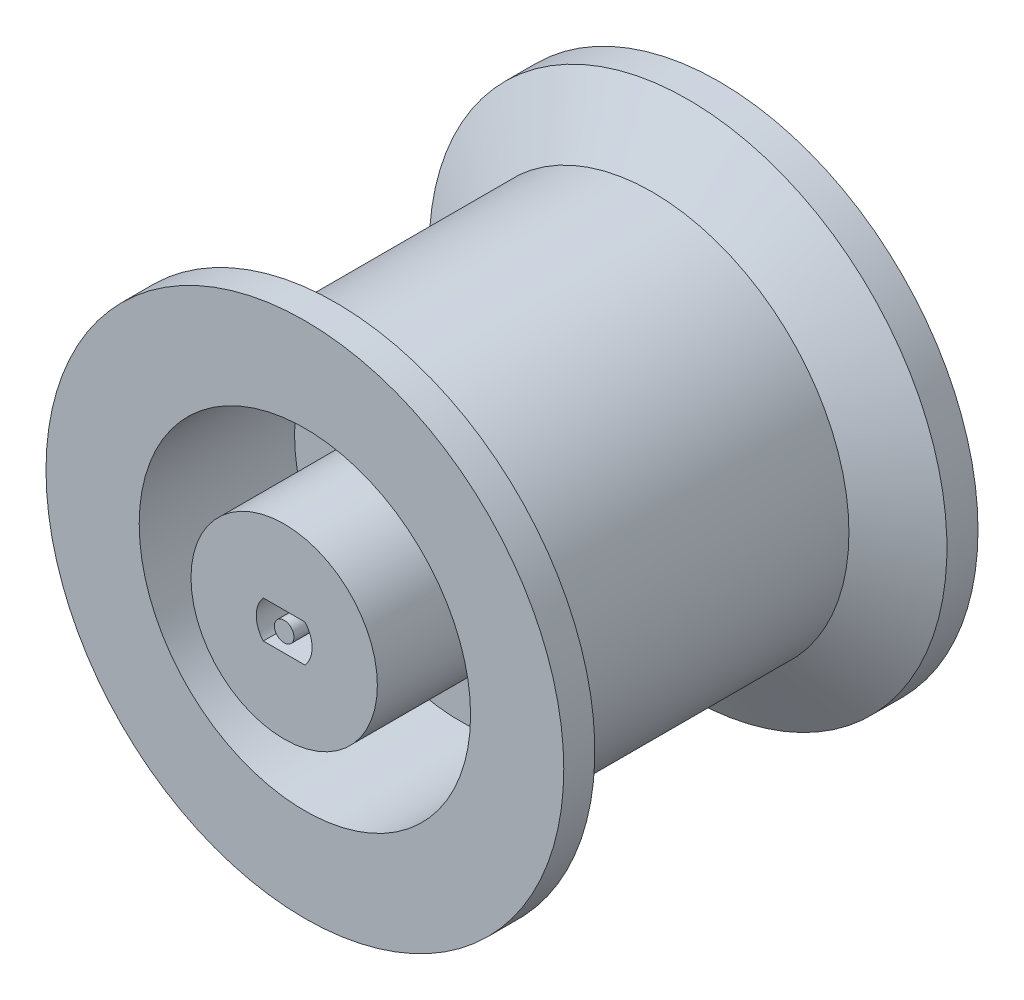
ISO-10303-21;
HEADER;
FILE_DESCRIPTION(('STEP AP214'),'2;1');
FILE_NAME('part.step','',(''),(''),'','','');
FILE_SCHEMA(('AUTOMOTIVE_DESIGN { 1 0 10303 214 1 1 1 1 }'));
ENDSEC;
DATA;
#1=APPLICATION_CONTEXT('core data for automotive mechanical design processes');
#2=APPLICATION_PROTOCOL_DEFINITION('international standard','automotive_design',2000,#1);
#3=PRODUCT_CONTEXT('',#1,'mechanical');
#4=PRODUCT('Part','Part','',(#3));
#5=PRODUCT_RELATED_PRODUCT_CATEGORY('part','',(#4));
#6=PRODUCT_DEFINITION_FORMATION('','',#4);
#7=PRODUCT_DEFINITION_CONTEXT('part definition',#1,'design');
#8=PRODUCT_DEFINITION('design','',#6,#7);
#9=PRODUCT_DEFINITION_SHAPE('','',#8);
#10=(LENGTH_UNIT() NAMED_UNIT(*) SI_UNIT(.MILLI.,.METRE.));
#11=(NAMED_UNIT(*) PLANE_ANGLE_UNIT() SI_UNIT($,.RADIAN.));
#12=(NAMED_UNIT(*) SI_UNIT($,.STERADIAN.) SOLID_ANGLE_UNIT());
#13=UNCERTAINTY_MEASURE_WITH_UNIT(LENGTH_MEASURE(1.E-05),#10,'distance_accuracy_value','');
#14=(GEOMETRIC_REPRESENTATION_CONTEXT(3) GLOBAL_UNCERTAINTY_ASSIGNED_CONTEXT((#13)) GLOBAL_UNIT_ASSIGNED_CONTEXT((#10,
#11,#12)) REPRESENTATION_CONTEXT('',''));
#15=CARTESIAN_POINT('',(0.,0.,0.));
#16=DIRECTION('',(0.,0.,1.));
#17=DIRECTION('',(1.,0.,0.));
#18=AXIS2_PLACEMENT_3D('',#15,#16,#17);
#19=CARTESIAN_POINT('',(0.,0.,20.));
#20=DIRECTION('',(0.,0.,-1.));
#21=DIRECTION('',(-1.,0.,0.));
#22=AXIS2_PLACEMENT_3D('',#19,#20,#21);
#23=CYLINDRICAL_SURFACE('',#22,25.);
#24=CARTESIAN_POINT('',(0.,0.,-17.));
#25=DIRECTION('',(0.,0.,-1.));
#26=DIRECTION('',(-1.,0.,0.));
#27=AXIS2_PLACEMENT_3D('',#24,#25,#26);
#28=CIRCLE('',#27,25.);
#29=CARTESIAN_POINT('',(-25.,0.,-17.));
#30=VERTEX_POINT('',#29);
#31=EDGE_CURVE('E123',#30,#30,#28,.T.);
#32=ORIENTED_EDGE('',*,*,#31,.T.);
#33=EDGE_LOOP('',(#32));
#34=FACE_BOUND('',#33,.T.);
#35=CARTESIAN_POINT('',(0.,0.,-20.));
#36=DIRECTION('',(0.,0.,1.));
#37=DIRECTION('',(1.,0.,0.));
#38=AXIS2_PLACEMENT_3D('',#35,#36,#37);
#39=CIRCLE('',#38,25.);
#40=CARTESIAN_POINT('',(25.,0.,-20.));
#41=VERTEX_POINT('',#40);
#42=EDGE_CURVE('E160',#41,#41,#39,.T.);
#43=ORIENTED_EDGE('',*,*,#42,.T.);
#44=EDGE_LOOP('',(#43));
#45=FACE_BOUND('',#44,.T.);
#46=ADVANCED_FACE('F33',(#34,#45),#23,.T.);
#47=CARTESIAN_POINT('',(0.,0.,20.));
#48=DIRECTION('',(0.,0.,1.));
#49=DIRECTION('',(1.,0.,0.));
#50=AXIS2_PLACEMENT_3D('',#47,#48,#49);
#51=PLANE('',#50);
#52=CARTESIAN_POINT('',(0.,0.,20.));
#53=DIRECTION('',(0.,0.,1.));
#54=DIRECTION('',(1.,0.,0.));
#55=AXIS2_PLACEMENT_3D('',#52,#53,#54);
#56=CIRCLE('',#55,16.);
#57=CARTESIAN_POINT('',(16.,0.,20.));
#58=VERTEX_POINT('',#57);
#59=EDGE_CURVE('E153',#58,#58,#56,.T.);
#60=ORIENTED_EDGE('',*,*,#59,.F.);
#61=EDGE_LOOP('',(#60));
#62=FACE_BOUND('',#61,.T.);
#63=CARTESIAN_POINT('',(0.,0.,20.));
#64=DIRECTION('',(0.,0.,1.));
#65=DIRECTION('',(1.,0.,0.));
#66=AXIS2_PLACEMENT_3D('',#63,#64,#65);
#67=CIRCLE('',#66,25.);
#68=CARTESIAN_POINT('',(25.,0.,20.));
#69=VERTEX_POINT('',#68);
#70=EDGE_CURVE('E163',#69,#69,#67,.T.);
#71=ORIENTED_EDGE('',*,*,#70,.T.);
#72=EDGE_LOOP('',(#71));
#73=FACE_BOUND('',#72,.T.);
#74=ADVANCED_FACE('F209',(#62,#73),#51,.T.);
#75=CARTESIAN_POINT('',(0.,0.,-20.));
#76=DIRECTION('',(0.,0.,1.));
#77=DIRECTION('',(1.,0.,0.));
#78=AXIS2_PLACEMENT_3D('',#75,#76,#77);
#79=PLANE('',#78);
#80=CARTESIAN_POINT('',(0.,0.,-20.));
#81=DIRECTION('',(0.,0.,1.));
#82=DIRECTION('',(1.,0.,0.));
#83=AXIS2_PLACEMENT_3D('',#80,#81,#82);
#84=CIRCLE('',#83,16.);
#85=CARTESIAN_POINT('',(16.,0.,-20.));
#86=VERTEX_POINT('',#85);
#87=EDGE_CURVE('E154',#86,#86,#84,.T.);
#88=ORIENTED_EDGE('',*,*,#87,.T.);
#89=EDGE_LOOP('',(#88));
#90=FACE_BOUND('',#89,.T.);
#91=ORIENTED_EDGE('',*,*,#42,.F.);
#92=EDGE_LOOP('',(#91));
#93=FACE_BOUND('',#92,.T.);
#94=ADVANCED_FACE('F206',(#90,#93),#79,.F.);
#95=CARTESIAN_POINT('',(0.,0.,17.));
#96=DIRECTION('',(0.,0.,-1.));
#97=DIRECTION('',(-1.,0.,0.));
#98=AXIS2_PLACEMENT_3D('',#95,#96,#97);
#99=CIRCLE('',#98,25.);
#100=CARTESIAN_POINT('',(-25.,0.,17.));
#101=VERTEX_POINT('',#100);
#102=EDGE_CURVE('E112',#101,#101,#99,.T.);
#103=ORIENTED_EDGE('',*,*,#102,.F.);
#104=EDGE_LOOP('',(#103));
#105=FACE_BOUND('',#104,.T.);
#106=ORIENTED_EDGE('',*,*,#70,.F.);
#107=EDGE_LOOP('',(#106));
#108=FACE_BOUND('',#107,.T.);
#109=ADVANCED_FACE('F35',(#105,#108),#23,.T.);
#110=CARTESIAN_POINT('',(0.,0.,5.));
#111=DIRECTION('',(0.,0.,1.));
#112=DIRECTION('',(1.,0.,0.));
#113=AXIS2_PLACEMENT_3D('',#110,#111,#112);
#114=CYLINDRICAL_SURFACE('',#113,16.);
#115=CARTESIAN_POINT('',(0.,0.,5.));
#116=DIRECTION('',(0.,0.,1.));
#117=DIRECTION('',(1.,0.,0.));
#118=AXIS2_PLACEMENT_3D('',#115,#116,#117);
#119=CIRCLE('',#118,16.);
#120=CARTESIAN_POINT('',(16.,0.,5.));
#121=VERTEX_POINT('',#120);
#122=EDGE_CURVE('E157',#121,#121,#119,.T.);
#123=ORIENTED_EDGE('',*,*,#122,.F.);
#124=EDGE_LOOP('',(#123));
#125=FACE_BOUND('',#124,.T.);
#126=ORIENTED_EDGE('',*,*,#59,.T.);
#127=EDGE_LOOP('',(#126));
#128=FACE_BOUND('',#127,.T.);
#129=ADVANCED_FACE('F220',(#125,#128),#114,.F.);
#130=CARTESIAN_POINT('',(0.,0.,5.));
#131=DIRECTION('',(0.,0.,1.));
#132=DIRECTION('',(1.,0.,0.));
#133=AXIS2_PLACEMENT_3D('',#130,#131,#132);
#134=PLANE('',#133);
#135=CARTESIAN_POINT('',(0.,0.,5.));
#136=DIRECTION('',(0.,0.,1.));
#137=DIRECTION('',(1.,0.,0.));
#138=AXIS2_PLACEMENT_3D('',#135,#136,#137);
#139=CIRCLE('',#138,9.);
#140=CARTESIAN_POINT('',(9.,0.,5.));
#141=VERTEX_POINT('',#140);
#142=EDGE_CURVE('E11',#141,#141,#139,.T.);
#143=ORIENTED_EDGE('',*,*,#142,.F.);
#144=EDGE_LOOP('',(#143));
#145=FACE_BOUND('',#144,.T.);
#146=CARTESIAN_POINT('',(11.4126781955418,3.7082039324995,5.));
#147=DIRECTION('',(0.,0.,1.));
#148=DIRECTION('',(0.309016994374958,-0.95105651629515,0.));
#149=AXIS2_PLACEMENT_3D('',#146,#147,#148);
#150=CIRCLE('',#149,2.5);
#151=CARTESIAN_POINT('',(12.1852206814792,1.33056264176162,5.));
#152=VERTEX_POINT('',#151);
#153=EDGE_CURVE('E131',#152,#152,#150,.T.);
#154=ORIENTED_EDGE('',*,*,#153,.F.);
#155=EDGE_LOOP('',(#154));
#156=FACE_BOUND('',#155,.T.);
#157=CARTESIAN_POINT('',(7.05342302750976,-9.70820393249931,5.));
#158=DIRECTION('',(0.,0.,1.));
#159=DIRECTION('',(-0.809016994374942,-0.58778525229248,0.));
#160=AXIS2_PLACEMENT_3D('',#157,#158,#159);
#161=CIRCLE('',#160,2.5);
#162=CARTESIAN_POINT('',(5.03088054157241,-11.1776670632305,5.));
#163=VERTEX_POINT('',#162);
#164=EDGE_CURVE('E137',#163,#163,#161,.T.);
#165=ORIENTED_EDGE('',*,*,#164,.F.);
#166=EDGE_LOOP('',(#165));
#167=FACE_BOUND('',#166,.T.);
#168=CARTESIAN_POINT('',(-7.05342302750962,-9.70820393249941,5.));
#169=DIRECTION('',(0.,0.,1.));
#170=DIRECTION('',(-0.809016994374951,0.587785252292469,0.));
#171=AXIS2_PLACEMENT_3D('',#168,#169,#170);
#172=CIRCLE('',#171,2.5);
#173=CARTESIAN_POINT('',(-9.075965513447,-8.23874080176824,5.));
#174=VERTEX_POINT('',#173);
#175=EDGE_CURVE('E133',#174,#174,#172,.T.);
#176=ORIENTED_EDGE('',*,*,#175,.F.);
#177=EDGE_LOOP('',(#176));
#178=FACE_BOUND('',#177,.T.);
#179=CARTESIAN_POINT('',(-11.4126781955419,3.70820393249934,5.));
#180=DIRECTION('',(0.,0.,1.));
#181=DIRECTION('',(0.309016994374945,0.951056516295155,0.));
#182=AXIS2_PLACEMENT_3D('',#179,#180,#181);
#183=CIRCLE('',#182,2.5);
#184=CARTESIAN_POINT('',(-10.6401357096045,6.08584522323723,5.));
#185=VERTEX_POINT('',#184);
#186=EDGE_CURVE('E136',#185,#185,#183,.T.);
#187=ORIENTED_EDGE('',*,*,#186,.F.);
#188=EDGE_LOOP('',(#187));
#189=FACE_BOUND('',#188,.T.);
#190=CARTESIAN_POINT('',(0.,12.,5.));
#191=DIRECTION('',(0.,0.,1.));
#192=DIRECTION('',(1.,0.,0.));
#193=AXIS2_PLACEMENT_3D('',#190,#191,#192);
#194=CIRCLE('',#193,2.5);
#195=CARTESIAN_POINT('',(2.5,12.,5.));
#196=VERTEX_POINT('',#195);
#197=EDGE_CURVE('E145',#196,#196,#194,.T.);
#198=ORIENTED_EDGE('',*,*,#197,.F.);
#199=EDGE_LOOP('',(#198));
#200=FACE_BOUND('',#199,.T.);
#201=ORIENTED_EDGE('',*,*,#122,.T.);
#202=EDGE_LOOP('',(#201));
#203=FACE_BOUND('',#202,.T.);
#204=ADVANCED_FACE('F202',(#145,#156,#167,#178,#189,#200,#203),#134,.T.);
#205=CARTESIAN_POINT('',(0.,0.,-5.));
#206=DIRECTION('',(0.,0.,-1.));
#207=DIRECTION('',(-1.,0.,0.));
#208=AXIS2_PLACEMENT_3D('',#205,#206,#207);
#209=CYLINDRICAL_SURFACE('',#208,16.);
#210=CARTESIAN_POINT('',(0.,0.,-5.));
#211=DIRECTION('',(0.,0.,1.));
#212=DIRECTION('',(1.,0.,0.));
#213=AXIS2_PLACEMENT_3D('',#210,#211,#212);
#214=CIRCLE('',#213,16.);
#215=CARTESIAN_POINT('',(16.,0.,-5.));
#216=VERTEX_POINT('',#215);
#217=EDGE_CURVE('E150',#216,#216,#214,.T.);
#218=ORIENTED_EDGE('',*,*,#217,.T.);
#219=EDGE_LOOP('',(#218));
#220=FACE_BOUND('',#219,.T.);
#221=ORIENTED_EDGE('',*,*,#87,.F.);
#222=EDGE_LOOP('',(#221));
#223=FACE_BOUND('',#222,.T.);
#224=ADVANCED_FACE('F187',(#220,#223),#209,.F.);
#225=CARTESIAN_POINT('',(0.,0.,-5.));
#226=DIRECTION('',(0.,0.,-1.));
#227=DIRECTION('',(1.,0.,0.));
#228=AXIS2_PLACEMENT_3D('',#225,#226,#227);
#229=PLANE('',#228);
#230=CARTESIAN_POINT('',(0.,0.,-5.));
#231=DIRECTION('',(0.,0.,-1.));
#232=DIRECTION('',(-1.,0.,0.));
#233=AXIS2_PLACEMENT_3D('',#230,#231,#232);
#234=CIRCLE('',#233,9.);
#235=CARTESIAN_POINT('',(-9.,0.,-5.));
#236=VERTEX_POINT('',#235);
#237=EDGE_CURVE('E37',#236,#236,#234,.T.);
#238=ORIENTED_EDGE('',*,*,#237,.F.);
#239=EDGE_LOOP('',(#238));
#240=FACE_BOUND('',#239,.T.);
#241=CARTESIAN_POINT('',(11.4126781955418,3.7082039324995,-5.));
#242=DIRECTION('',(0.,0.,-1.));
#243=DIRECTION('',(-1.,0.,0.));
#244=AXIS2_PLACEMENT_3D('',#241,#242,#243);
#245=CIRCLE('',#244,2.5);
#246=CARTESIAN_POINT('',(8.9126781955418,3.7082039324995,-5.));
#247=VERTEX_POINT('',#246);
#248=EDGE_CURVE('E149',#247,#247,#245,.T.);
#249=ORIENTED_EDGE('',*,*,#248,.F.);
#250=EDGE_LOOP('',(#249));
#251=FACE_BOUND('',#250,.T.);
#252=CARTESIAN_POINT('',(7.05342302750976,-9.70820393249931,-5.));
#253=DIRECTION('',(0.,0.,-1.));
#254=DIRECTION('',(-1.,0.,0.));
#255=AXIS2_PLACEMENT_3D('',#252,#253,#254);
#256=CIRCLE('',#255,2.5);
#257=CARTESIAN_POINT('',(4.55342302750976,-9.70820393249931,-5.));
#258=VERTEX_POINT('',#257);
#259=EDGE_CURVE('E175',#258,#258,#256,.T.);
#260=ORIENTED_EDGE('',*,*,#259,.F.);
#261=EDGE_LOOP('',(#260));
#262=FACE_BOUND('',#261,.T.);
#263=CARTESIAN_POINT('',(-7.05342302750962,-9.70820393249941,-5.));
#264=DIRECTION('',(0.,0.,-1.));
#265=DIRECTION('',(-1.,0.,0.));
#266=AXIS2_PLACEMENT_3D('',#263,#264,#265);
#267=CIRCLE('',#266,2.5);
#268=CARTESIAN_POINT('',(-9.55342302750963,-9.70820393249941,-5.));
#269=VERTEX_POINT('',#268);
#270=EDGE_CURVE('E172',#269,#269,#267,.T.);
#271=ORIENTED_EDGE('',*,*,#270,.F.);
#272=EDGE_LOOP('',(#271));
#273=FACE_BOUND('',#272,.T.);
#274=CARTESIAN_POINT('',(-11.4126781955419,3.70820393249934,-5.));
#275=DIRECTION('',(0.,0.,-1.));
#276=DIRECTION('',(-1.,0.,0.));
#277=AXIS2_PLACEMENT_3D('',#274,#275,#276);
#278=CIRCLE('',#277,2.5);
#279=CARTESIAN_POINT('',(-13.9126781955419,3.70820393249934,-5.));
#280=VERTEX_POINT('',#279);
#281=EDGE_CURVE('E144',#280,#280,#278,.T.);
#282=ORIENTED_EDGE('',*,*,#281,.F.);
#283=EDGE_LOOP('',(#282));
#284=FACE_BOUND('',#283,.T.);
#285=CARTESIAN_POINT('',(0.,12.,-5.));
#286=DIRECTION('',(0.,0.,-1.));
#287=DIRECTION('',(-1.,0.,0.));
#288=AXIS2_PLACEMENT_3D('',#285,#286,#287);
#289=CIRCLE('',#288,2.5);
#290=CARTESIAN_POINT('',(-2.5,12.,-5.));
#291=VERTEX_POINT('',#290);
#292=EDGE_CURVE('E148',#291,#291,#289,.T.);
#293=ORIENTED_EDGE('',*,*,#292,.F.);
#294=EDGE_LOOP('',(#293));
#295=FACE_BOUND('',#294,.T.);
#296=ORIENTED_EDGE('',*,*,#217,.F.);
#297=EDGE_LOOP('',(#296));
#298=FACE_BOUND('',#297,.T.);
#299=ADVANCED_FACE('F183',(#240,#251,#262,#273,#284,#295,#298),#229,.T.);
#300=CARTESIAN_POINT('',(0.,12.,-20.));
#301=DIRECTION('',(0.,0.,1.));
#302=DIRECTION('',(1.,0.,0.));
#303=AXIS2_PLACEMENT_3D('',#300,#301,#302);
#304=CYLINDRICAL_SURFACE('',#303,2.5);
#305=ORIENTED_EDGE('',*,*,#292,.T.);
#306=EDGE_LOOP('',(#305));
#307=FACE_BOUND('',#306,.T.);
#308=ORIENTED_EDGE('',*,*,#197,.T.);
#309=EDGE_LOOP('',(#308));
#310=FACE_BOUND('',#309,.T.);
#311=ADVANCED_FACE('F186',(#307,#310),#304,.F.);
#312=CARTESIAN_POINT('',(-11.4126781955419,3.70820393249934,-20.));
#313=DIRECTION('',(0.,0.,1.));
#314=DIRECTION('',(1.,0.,0.));
#315=AXIS2_PLACEMENT_3D('',#312,#313,#314);
#316=CYLINDRICAL_SURFACE('',#315,2.5);
#317=ORIENTED_EDGE('',*,*,#281,.T.);
#318=EDGE_LOOP('',(#317));
#319=FACE_BOUND('',#318,.T.);
#320=ORIENTED_EDGE('',*,*,#186,.T.);
#321=EDGE_LOOP('',(#320));
#322=FACE_BOUND('',#321,.T.);
#323=ADVANCED_FACE('F270',(#319,#322),#316,.F.);
#324=CARTESIAN_POINT('',(-7.05342302750962,-9.70820393249941,-20.));
#325=DIRECTION('',(0.,0.,1.));
#326=DIRECTION('',(1.,0.,0.));
#327=AXIS2_PLACEMENT_3D('',#324,#325,#326);
#328=CYLINDRICAL_SURFACE('',#327,2.5);
#329=ORIENTED_EDGE('',*,*,#270,.T.);
#330=EDGE_LOOP('',(#329));
#331=FACE_BOUND('',#330,.T.);
#332=ORIENTED_EDGE('',*,*,#175,.T.);
#333=EDGE_LOOP('',(#332));
#334=FACE_BOUND('',#333,.T.);
#335=ADVANCED_FACE('F266',(#331,#334),#328,.F.);
#336=CARTESIAN_POINT('',(7.05342302750976,-9.70820393249931,-20.));
#337=DIRECTION('',(0.,0.,1.));
#338=DIRECTION('',(1.,0.,0.));
#339=AXIS2_PLACEMENT_3D('',#336,#337,#338);
#340=CYLINDRICAL_SURFACE('',#339,2.5);
#341=ORIENTED_EDGE('',*,*,#259,.T.);
#342=EDGE_LOOP('',(#341));
#343=FACE_BOUND('',#342,.T.);
#344=ORIENTED_EDGE('',*,*,#164,.T.);
#345=EDGE_LOOP('',(#344));
#346=FACE_BOUND('',#345,.T.);
#347=ADVANCED_FACE('F269',(#343,#346),#340,.F.);
#348=CARTESIAN_POINT('',(11.4126781955418,3.7082039324995,-20.));
#349=DIRECTION('',(0.,0.,1.));
#350=DIRECTION('',(1.,0.,0.));
#351=AXIS2_PLACEMENT_3D('',#348,#349,#350);
#352=CYLINDRICAL_SURFACE('',#351,2.5);
#353=ORIENTED_EDGE('',*,*,#248,.T.);
#354=EDGE_LOOP('',(#353));
#355=FACE_BOUND('',#354,.T.);
#356=ORIENTED_EDGE('',*,*,#153,.T.);
#357=EDGE_LOOP('',(#356));
#358=FACE_BOUND('',#357,.T.);
#359=ADVANCED_FACE('F180',(#355,#358),#352,.F.);
#360=CARTESIAN_POINT('',(0.,0.,-7.));
#361=DIRECTION('',(0.,0.,1.));
#362=DIRECTION('',(1.,0.,0.));
#363=AXIS2_PLACEMENT_3D('',#360,#361,#362);
#364=CYLINDRICAL_SURFACE('',#363,9.);
#365=ORIENTED_EDGE('',*,*,#237,.T.);
#366=EDGE_LOOP('',(#365));
#367=FACE_BOUND('',#366,.T.);
#368=CARTESIAN_POINT('',(0.,0.,-7.));
#369=DIRECTION('',(0.,0.,1.));
#370=DIRECTION('',(1.,0.,0.));
#371=AXIS2_PLACEMENT_3D('',#368,#369,#370);
#372=CIRCLE('',#371,9.);
#373=CARTESIAN_POINT('',(9.,0.,-7.));
#374=VERTEX_POINT('',#373);
#375=EDGE_CURVE('E129',#374,#374,#372,.T.);
#376=ORIENTED_EDGE('',*,*,#375,.T.);
#377=EDGE_LOOP('',(#376));
#378=FACE_BOUND('',#377,.T.);
#379=ADVANCED_FACE('F261',(#367,#378),#364,.T.);
#380=CARTESIAN_POINT('',(0.,0.,-7.));
#381=DIRECTION('',(0.,0.,1.));
#382=DIRECTION('',(1.,0.,0.));
#383=AXIS2_PLACEMENT_3D('',#380,#381,#382);
#384=PLANE('',#383);
#385=ORIENTED_EDGE('',*,*,#375,.F.);
#386=EDGE_LOOP('',(#385));
#387=FACE_BOUND('',#386,.T.);
#388=ADVANCED_FACE('F258',(#387),#384,.F.);
#389=ORIENTED_EDGE('',*,*,#142,.T.);
#390=EDGE_LOOP('',(#389));
#391=FACE_BOUND('',#390,.T.);
#392=CARTESIAN_POINT('',(0.,0.,22.));
#393=DIRECTION('',(0.,0.,1.));
#394=DIRECTION('',(1.,0.,0.));
#395=AXIS2_PLACEMENT_3D('',#392,#393,#394);
#396=CIRCLE('',#395,9.);
#397=CARTESIAN_POINT('',(9.,0.,22.));
#398=VERTEX_POINT('',#397);
#399=EDGE_CURVE('E126',#398,#398,#396,.T.);
#400=ORIENTED_EDGE('',*,*,#399,.F.);
#401=EDGE_LOOP('',(#400));
#402=FACE_BOUND('',#401,.T.);
#403=ADVANCED_FACE('F256',(#391,#402),#364,.T.);
#404=CARTESIAN_POINT('',(0.,0.,22.));
#405=DIRECTION('',(0.,0.,1.));
#406=DIRECTION('',(1.,0.,0.));
#407=AXIS2_PLACEMENT_3D('',#404,#405,#406);
#408=PLANE('',#407);
#409=CARTESIAN_POINT('',(0.0242155354449412,0.,22.));
#410=DIRECTION('',(0.,0.,1.));
#411=DIRECTION('',(1.,0.,0.));
#412=AXIS2_PLACEMENT_3D('',#409,#410,#411);
#413=CIRCLE('',#412,2.72);
#414=CARTESIAN_POINT('',(-2.015,1.8,22.));
#415=VERTEX_POINT('',#414);
#416=CARTESIAN_POINT('',(-2.015,-1.8,22.));
#417=VERTEX_POINT('',#416);
#418=EDGE_CURVE('E49',#415,#417,#413,.T.);
#419=ORIENTED_EDGE('',*,*,#418,.F.);
#420=DIRECTION('',(-1.,0.,0.));
#421=VECTOR('',#420,1.);
#422=CARTESIAN_POINT('',(-2.015,1.8,22.));
#423=LINE('',#422,#421);
#424=CARTESIAN_POINT('',(2.015,1.8,22.));
#425=VERTEX_POINT('',#424);
#426=EDGE_CURVE('E100',#425,#415,#423,.T.);
#427=ORIENTED_EDGE('',*,*,#426,.F.);
#428=CARTESIAN_POINT('',(-0.0242155354449412,0.,22.));
#429=DIRECTION('',(0.,0.,1.));
#430=DIRECTION('',(-1.,0.,0.));
#431=AXIS2_PLACEMENT_3D('',#428,#429,#430);
#432=CIRCLE('',#431,2.72);
#433=CARTESIAN_POINT('',(2.015,-1.8,22.));
#434=VERTEX_POINT('',#433);
#435=EDGE_CURVE('E108',#434,#425,#432,.T.);
#436=ORIENTED_EDGE('',*,*,#435,.F.);
#437=DIRECTION('',(1.,0.,0.));
#438=VECTOR('',#437,1.);
#439=CARTESIAN_POINT('',(-2.015,-1.8,22.));
#440=LINE('',#439,#438);
#441=EDGE_CURVE('E84',#417,#434,#440,.T.);
#442=ORIENTED_EDGE('',*,*,#441,.F.);
#443=EDGE_LOOP('',(#419,#427,#436,#442));
#444=FACE_BOUND('',#443,.T.);
#445=ORIENTED_EDGE('',*,*,#399,.T.);
#446=EDGE_LOOP('',(#445));
#447=FACE_BOUND('',#446,.T.);
#448=ADVANCED_FACE('F252',(#444,#447),#408,.T.);
#449=CARTESIAN_POINT('',(0.,0.,-13.5358983848622));
#450=DIRECTION('',(0.,0.,-1.));
#451=DIRECTION('',(-1.,0.,0.));
#452=AXIS2_PLACEMENT_3D('',#449,#450,#451);
#453=CONICAL_SURFACE('',#452,19.,1.04719755119659);
#454=ORIENTED_EDGE('',*,*,#31,.F.);
#455=EDGE_LOOP('',(#454));
#456=FACE_BOUND('',#455,.T.);
#457=CARTESIAN_POINT('',(0.,0.,-13.5358983848622));
#458=DIRECTION('',(0.,0.,-1.));
#459=DIRECTION('',(-1.,0.,0.));
#460=AXIS2_PLACEMENT_3D('',#457,#458,#459);
#461=CIRCLE('',#460,19.);
#462=CARTESIAN_POINT('',(-19.,0.,-13.5358983848622));
#463=VERTEX_POINT('',#462);
#464=EDGE_CURVE('E120',#463,#463,#461,.T.);
#465=ORIENTED_EDGE('',*,*,#464,.T.);
#466=EDGE_LOOP('',(#465));
#467=FACE_BOUND('',#466,.T.);
#468=ADVANCED_FACE('F244',(#456,#467),#453,.T.);
#469=CARTESIAN_POINT('',(0.,0.,-25.2845931145285));
#470=DIRECTION('',(0.,0.,-1.));
#471=DIRECTION('',(-1.,0.,0.));
#472=AXIS2_PLACEMENT_3D('',#469,#470,#471);
#473=CYLINDRICAL_SURFACE('',#472,19.);
#474=ORIENTED_EDGE('',*,*,#464,.F.);
#475=EDGE_LOOP('',(#474));
#476=FACE_BOUND('',#475,.T.);
#477=CARTESIAN_POINT('',(0.,0.,13.5358983848622));
#478=DIRECTION('',(0.,0.,-1.));
#479=DIRECTION('',(-1.,0.,0.));
#480=AXIS2_PLACEMENT_3D('',#477,#478,#479);
#481=CIRCLE('',#480,19.);
#482=CARTESIAN_POINT('',(-19.,0.,13.5358983848622));
#483=VERTEX_POINT('',#482);
#484=EDGE_CURVE('E117',#483,#483,#481,.T.);
#485=ORIENTED_EDGE('',*,*,#484,.T.);
#486=EDGE_LOOP('',(#485));
#487=FACE_BOUND('',#486,.T.);
#488=ADVANCED_FACE('F235',(#476,#487),#473,.T.);
#489=CARTESIAN_POINT('',(0.,0.,17.));
#490=DIRECTION('',(0.,0.,1.));
#491=DIRECTION('',(1.,0.,0.));
#492=AXIS2_PLACEMENT_3D('',#489,#490,#491);
#493=CONICAL_SURFACE('',#492,25.,1.04719755119659);
#494=ORIENTED_EDGE('',*,*,#484,.F.);
#495=EDGE_LOOP('',(#494));
#496=FACE_BOUND('',#495,.T.);
#497=ORIENTED_EDGE('',*,*,#102,.T.);
#498=EDGE_LOOP('',(#497));
#499=FACE_BOUND('',#498,.T.);
#500=ADVANCED_FACE('F232',(#496,#499),#493,.T.);
#501=CARTESIAN_POINT('',(0.0242155354449412,0.,14.3));
#502=DIRECTION('',(0.,0.,1.));
#503=DIRECTION('',(1.,0.,0.));
#504=AXIS2_PLACEMENT_3D('',#501,#502,#503);
#505=CYLINDRICAL_SURFACE('',#504,2.72);
#506=ORIENTED_EDGE('',*,*,#418,.T.);
#507=DIRECTION('',(0.,0.,1.));
#508=VECTOR('',#507,1.);
#509=CARTESIAN_POINT('',(-2.015,-1.8,14.3));
#510=LINE('',#509,#508);
#511=CARTESIAN_POINT('',(-2.015,-1.8,14.3));
#512=VERTEX_POINT('',#511);
#513=EDGE_CURVE('E72',#512,#417,#510,.T.);
#514=ORIENTED_EDGE('',*,*,#513,.F.);
#515=CARTESIAN_POINT('',(0.0242155354449412,0.,14.3));
#516=DIRECTION('',(0.,0.,1.));
#517=DIRECTION('',(1.,0.,0.));
#518=AXIS2_PLACEMENT_3D('',#515,#516,#517);
#519=CIRCLE('',#518,2.72);
#520=CARTESIAN_POINT('',(-2.015,1.8,14.3));
#521=VERTEX_POINT('',#520);
#522=EDGE_CURVE('E98',#521,#512,#519,.T.);
#523=ORIENTED_EDGE('',*,*,#522,.F.);
#524=DIRECTION('',(0.,0.,1.));
#525=VECTOR('',#524,1.);
#526=CARTESIAN_POINT('',(-2.015,1.8,14.3));
#527=LINE('',#526,#525);
#528=EDGE_CURVE('E57',#521,#415,#527,.T.);
#529=ORIENTED_EDGE('',*,*,#528,.T.);
#530=EDGE_LOOP('',(#506,#514,#523,#529));
#531=FACE_BOUND('',#530,.T.);
#532=ADVANCED_FACE('F234',(#531),#505,.F.);
#533=CARTESIAN_POINT('',(-2.015,1.8,14.3));
#534=DIRECTION('',(0.,1.,0.));
#535=DIRECTION('',(0.,0.,1.));
#536=AXIS2_PLACEMENT_3D('',#533,#534,#535);
#537=PLANE('',#536);
#538=ORIENTED_EDGE('',*,*,#426,.T.);
#539=ORIENTED_EDGE('',*,*,#528,.F.);
#540=DIRECTION('',(-1.,0.,0.));
#541=VECTOR('',#540,1.);
#542=CARTESIAN_POINT('',(-2.015,1.8,14.3));
#543=LINE('',#542,#541);
#544=CARTESIAN_POINT('',(2.015,1.8,14.3));
#545=VERTEX_POINT('',#544);
#546=EDGE_CURVE('E95',#545,#521,#543,.T.);
#547=ORIENTED_EDGE('',*,*,#546,.F.);
#548=DIRECTION('',(0.,0.,1.));
#549=VECTOR('',#548,1.);
#550=CARTESIAN_POINT('',(2.015,1.8,14.3));
#551=LINE('',#550,#549);
#552=EDGE_CURVE('E88',#545,#425,#551,.T.);
#553=ORIENTED_EDGE('',*,*,#552,.T.);
#554=EDGE_LOOP('',(#538,#539,#547,#553));
#555=FACE_BOUND('',#554,.T.);
#556=ADVANCED_FACE('F242',(#555),#537,.F.);
#557=CARTESIAN_POINT('',(-0.0242155354449412,0.,14.3));
#558=DIRECTION('',(0.,0.,1.));
#559=DIRECTION('',(1.,0.,0.));
#560=AXIS2_PLACEMENT_3D('',#557,#558,#559);
#561=CYLINDRICAL_SURFACE('',#560,2.72);
#562=ORIENTED_EDGE('',*,*,#435,.T.);
#563=ORIENTED_EDGE('',*,*,#552,.F.);
#564=CARTESIAN_POINT('',(-0.0242155354449412,0.,14.3));
#565=DIRECTION('',(0.,0.,1.));
#566=DIRECTION('',(-1.,0.,0.));
#567=AXIS2_PLACEMENT_3D('',#564,#565,#566);
#568=CIRCLE('',#567,2.72);
#569=CARTESIAN_POINT('',(2.015,-1.8,14.3));
#570=VERTEX_POINT('',#569);
#571=EDGE_CURVE('E91',#570,#545,#568,.T.);
#572=ORIENTED_EDGE('',*,*,#571,.F.);
#573=DIRECTION('',(0.,0.,1.));
#574=VECTOR('',#573,1.);
#575=CARTESIAN_POINT('',(2.015,-1.8,14.3));
#576=LINE('',#575,#574);
#577=EDGE_CURVE('E77',#570,#434,#576,.T.);
#578=ORIENTED_EDGE('',*,*,#577,.T.);
#579=EDGE_LOOP('',(#562,#563,#572,#578));
#580=FACE_BOUND('',#579,.T.);
#581=ADVANCED_FACE('F92',(#580),#561,.F.);
#582=CARTESIAN_POINT('',(-2.015,-1.8,14.3));
#583=DIRECTION('',(0.,-1.,0.));
#584=DIRECTION('',(0.,0.,-1.));
#585=AXIS2_PLACEMENT_3D('',#582,#583,#584);
#586=PLANE('',#585);
#587=ORIENTED_EDGE('',*,*,#441,.T.);
#588=ORIENTED_EDGE('',*,*,#577,.F.);
#589=DIRECTION('',(1.,0.,0.));
#590=VECTOR('',#589,1.);
#591=CARTESIAN_POINT('',(-2.015,-1.8,14.3));
#592=LINE('',#591,#590);
#593=EDGE_CURVE('E81',#512,#570,#592,.T.);
#594=ORIENTED_EDGE('',*,*,#593,.F.);
#595=ORIENTED_EDGE('',*,*,#513,.T.);
#596=EDGE_LOOP('',(#587,#588,#594,#595));
#597=FACE_BOUND('',#596,.T.);
#598=ADVANCED_FACE('F79',(#597),#586,.F.);
#599=CARTESIAN_POINT('',(0.0242155354449412,0.,14.3));
#600=DIRECTION('',(0.,0.,1.));
#601=DIRECTION('',(1.,0.,0.));
#602=AXIS2_PLACEMENT_3D('',#599,#600,#601);
#603=PLANE('',#602);
#604=CARTESIAN_POINT('',(0.,0.,14.3));
#605=DIRECTION('',(0.,0.,1.));
#606=DIRECTION('',(1.,0.,0.));
#607=AXIS2_PLACEMENT_3D('',#604,#605,#606);
#608=CIRCLE('',#607,0.945);
#609=CARTESIAN_POINT('',(0.945,0.,14.3));
#610=VERTEX_POINT('',#609);
#611=EDGE_CURVE('E411',#610,#610,#608,.T.);
#612=ORIENTED_EDGE('',*,*,#611,.F.);
#613=EDGE_LOOP('',(#612));
#614=FACE_BOUND('',#613,.T.);
#615=ORIENTED_EDGE('',*,*,#522,.T.);
#616=ORIENTED_EDGE('',*,*,#593,.T.);
#617=ORIENTED_EDGE('',*,*,#571,.T.);
#618=ORIENTED_EDGE('',*,*,#546,.T.);
#619=EDGE_LOOP('',(#615,#616,#617,#618));
#620=FACE_BOUND('',#619,.T.);
#621=ADVANCED_FACE('F97',(#614,#620),#603,.T.);
#622=CARTESIAN_POINT('',(0.,0.,24.6728636328852));
#623=DIRECTION('',(0.,0.,-1.));
#624=DIRECTION('',(-1.,0.,0.));
#625=AXIS2_PLACEMENT_3D('',#622,#623,#624);
#626=CYLINDRICAL_SURFACE('',#625,0.945);
#627=ORIENTED_EDGE('',*,*,#611,.T.);
#628=EDGE_LOOP('',(#627));
#629=FACE_BOUND('',#628,.T.);
#630=CARTESIAN_POINT('',(0.,0.,22.));
#631=DIRECTION('',(0.,0.,1.));
#632=DIRECTION('',(1.,0.,0.));
#633=AXIS2_PLACEMENT_3D('',#630,#631,#632);
#634=CIRCLE('',#633,0.945);
#635=CARTESIAN_POINT('',(0.945,0.,22.));
#636=VERTEX_POINT('',#635);
#637=EDGE_CURVE('E106',#636,#636,#634,.T.);
#638=ORIENTED_EDGE('',*,*,#637,.F.);
#639=EDGE_LOOP('',(#638));
#640=FACE_BOUND('',#639,.T.);
#641=ADVANCED_FACE('F381',(#629,#640),#626,.T.);
#642=CARTESIAN_POINT('',(0.,0.,22.));
#643=DIRECTION('',(0.,0.,1.));
#644=DIRECTION('',(1.,0.,0.));
#645=AXIS2_PLACEMENT_3D('',#642,#643,#644);
#646=PLANE('',#645);
#647=ORIENTED_EDGE('',*,*,#637,.T.);
#648=EDGE_LOOP('',(#647));
#649=FACE_BOUND('',#648,.T.);
#650=ADVANCED_FACE('F390',(#649),#646,.T.);
#651=CLOSED_SHELL('',(#46,#74,#94,#109,#129,#204,#224,#299,#311,#323,#335,#347,#359,#379,#388,
#403,#448,#468,#488,#500,#532,#556,#581,#598,#621,#641,#650));
#652=MANIFOLD_SOLID_BREP('B2',#651);
#653=ADVANCED_BREP_SHAPE_REPRESENTATION('',(#18,#652),#14);
#654=SHAPE_DEFINITION_REPRESENTATION(#9,#653);
ENDSEC;
END-ISO-10303-21;
